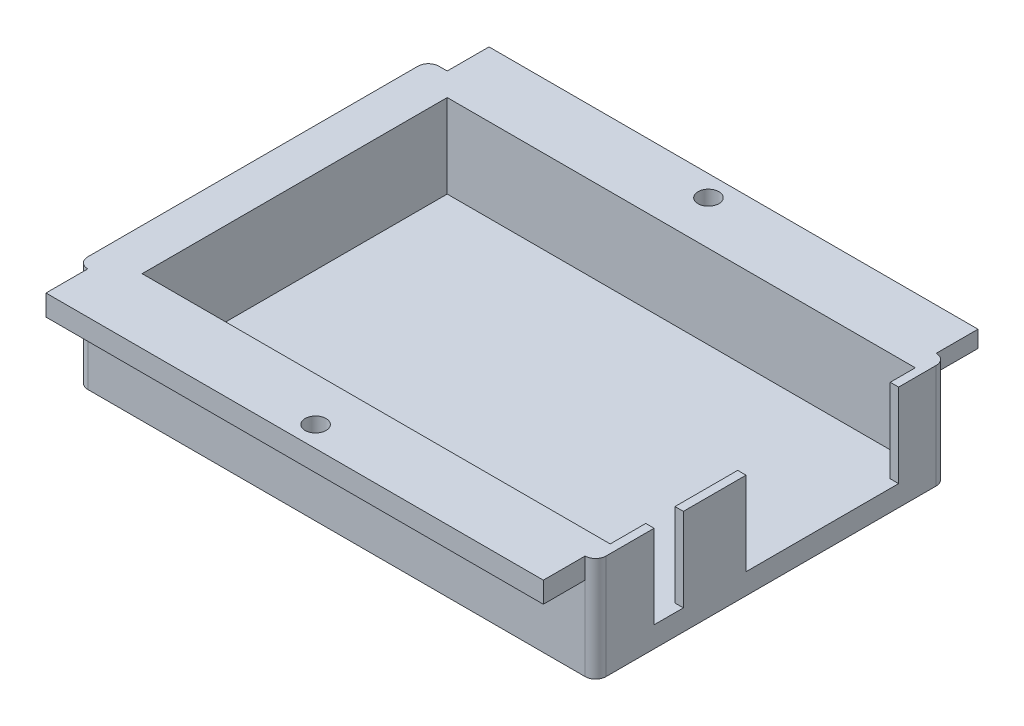
ISO-10303-21;
HEADER;
FILE_DESCRIPTION(('STEP AP214'),'2;1');
FILE_NAME('part.step','',(''),(''),'','','');
FILE_SCHEMA(('AUTOMOTIVE_DESIGN { 1 0 10303 214 1 1 1 1 }'));
ENDSEC;
DATA;
#1=APPLICATION_CONTEXT('core data for automotive mechanical design processes');
#2=APPLICATION_PROTOCOL_DEFINITION('international standard','automotive_design',2000,#1);
#3=PRODUCT_CONTEXT('',#1,'mechanical');
#4=PRODUCT('Part','Part','',(#3));
#5=PRODUCT_RELATED_PRODUCT_CATEGORY('part','',(#4));
#6=PRODUCT_DEFINITION_FORMATION('','',#4);
#7=PRODUCT_DEFINITION_CONTEXT('part definition',#1,'design');
#8=PRODUCT_DEFINITION('design','',#6,#7);
#9=PRODUCT_DEFINITION_SHAPE('','',#8);
#10=(LENGTH_UNIT() NAMED_UNIT(*) SI_UNIT(.MILLI.,.METRE.));
#11=(NAMED_UNIT(*) PLANE_ANGLE_UNIT() SI_UNIT($,.RADIAN.));
#12=(NAMED_UNIT(*) SI_UNIT($,.STERADIAN.) SOLID_ANGLE_UNIT());
#13=UNCERTAINTY_MEASURE_WITH_UNIT(LENGTH_MEASURE(1.E-05),#10,'distance_accuracy_value','');
#14=(GEOMETRIC_REPRESENTATION_CONTEXT(3) GLOBAL_UNCERTAINTY_ASSIGNED_CONTEXT((#13)) GLOBAL_UNIT_ASSIGNED_CONTEXT((#10,
#11,#12)) REPRESENTATION_CONTEXT('',''));
#15=CARTESIAN_POINT('',(0.,0.,0.));
#16=DIRECTION('',(0.,0.,1.));
#17=DIRECTION('',(1.,0.,0.));
#18=AXIS2_PLACEMENT_3D('',#15,#16,#17);
#19=CARTESIAN_POINT('',(-62.,25.,-42.));
#20=DIRECTION('',(0.,0.,1.));
#21=DIRECTION('',(1.,0.,0.));
#22=AXIS2_PLACEMENT_3D('',#19,#20,#21);
#23=PLANE('',#22);
#24=DIRECTION('',(-1.,0.,0.));
#25=VECTOR('',#24,1.);
#26=CARTESIAN_POINT('',(59.5,21.,-42.));
#27=LINE('',#26,#25);
#28=CARTESIAN_POINT('',(59.5,21.,-42.));
#29=VERTEX_POINT('',#28);
#30=CARTESIAN_POINT('',(-57.5,21.,-42.));
#31=VERTEX_POINT('',#30);
#32=EDGE_CURVE('E410',#29,#31,#27,.T.);
#33=ORIENTED_EDGE('',*,*,#32,.F.);
#34=DIRECTION('',(0.,-1.,0.));
#35=VECTOR('',#34,1.);
#36=CARTESIAN_POINT('',(59.5,25.,-42.));
#37=LINE('',#36,#35);
#38=CARTESIAN_POINT('',(59.5,0.,-42.));
#39=VERTEX_POINT('',#38);
#40=EDGE_CURVE('E385',#29,#39,#37,.T.);
#41=ORIENTED_EDGE('',*,*,#40,.T.);
#42=DIRECTION('',(-1.,0.,0.));
#43=VECTOR('',#42,1.);
#44=CARTESIAN_POINT('',(-62.,0.,-42.));
#45=LINE('',#44,#43);
#46=CARTESIAN_POINT('',(-59.5,0.,-42.));
#47=VERTEX_POINT('',#46);
#48=EDGE_CURVE('E364',#39,#47,#45,.T.);
#49=ORIENTED_EDGE('',*,*,#48,.T.);
#50=DIRECTION('',(0.,-1.,0.));
#51=VECTOR('',#50,1.);
#52=CARTESIAN_POINT('',(-59.5,25.,-42.));
#53=LINE('',#52,#51);
#54=CARTESIAN_POINT('',(-59.5,25.,-42.));
#55=VERTEX_POINT('',#54);
#56=EDGE_CURVE('E387',#47,#55,#53,.F.);
#57=ORIENTED_EDGE('',*,*,#56,.T.);
#58=DIRECTION('',(-1.,0.,0.));
#59=VECTOR('',#58,1.);
#60=CARTESIAN_POINT('',(-62.,25.,-42.));
#61=LINE('',#60,#59);
#62=CARTESIAN_POINT('',(-57.5,25.,-42.));
#63=VERTEX_POINT('',#62);
#64=EDGE_CURVE('E61',#63,#55,#61,.T.);
#65=ORIENTED_EDGE('',*,*,#64,.F.);
#66=DIRECTION('',(0.,1.,0.));
#67=VECTOR('',#66,1.);
#68=CARTESIAN_POINT('',(-57.5,25.,-42.));
#69=LINE('',#68,#67);
#70=EDGE_CURVE('E56',#31,#63,#69,.T.);
#71=ORIENTED_EDGE('',*,*,#70,.F.);
#72=EDGE_LOOP('',(#33,#41,#49,#57,#65,#71));
#73=FACE_BOUND('',#72,.T.);
#74=ADVANCED_FACE('F39',(#73),#23,.F.);
#75=CARTESIAN_POINT('',(-62.,25.,42.));
#76=DIRECTION('',(0.,0.,-1.));
#77=DIRECTION('',(-1.,0.,0.));
#78=AXIS2_PLACEMENT_3D('',#75,#76,#77);
#79=PLANE('',#78);
#80=DIRECTION('',(1.,0.,0.));
#81=VECTOR('',#80,1.);
#82=CARTESIAN_POINT('',(-59.5,20.,42.));
#83=LINE('',#82,#81);
#84=CARTESIAN_POINT('',(-59.5,20.,42.));
#85=VERTEX_POINT('',#84);
#86=CARTESIAN_POINT('',(59.5,20.,42.));
#87=VERTEX_POINT('',#86);
#88=EDGE_CURVE('E240',#85,#87,#83,.T.);
#89=ORIENTED_EDGE('',*,*,#88,.F.);
#90=DIRECTION('',(0.,-1.,0.));
#91=VECTOR('',#90,1.);
#92=CARTESIAN_POINT('',(-59.5,25.,42.));
#93=LINE('',#92,#91);
#94=CARTESIAN_POINT('',(-59.5,0.,42.));
#95=VERTEX_POINT('',#94);
#96=EDGE_CURVE('E402',#85,#95,#93,.T.);
#97=ORIENTED_EDGE('',*,*,#96,.T.);
#98=DIRECTION('',(1.,0.,0.));
#99=VECTOR('',#98,1.);
#100=CARTESIAN_POINT('',(-62.,0.,42.));
#101=LINE('',#100,#99);
#102=CARTESIAN_POINT('',(59.5,0.,42.));
#103=VERTEX_POINT('',#102);
#104=EDGE_CURVE('E370',#95,#103,#101,.T.);
#105=ORIENTED_EDGE('',*,*,#104,.T.);
#106=DIRECTION('',(0.,-1.,0.));
#107=VECTOR('',#106,1.);
#108=CARTESIAN_POINT('',(59.5,25.,42.));
#109=LINE('',#108,#107);
#110=EDGE_CURVE('E11',#103,#87,#109,.F.);
#111=ORIENTED_EDGE('',*,*,#110,.T.);
#112=EDGE_LOOP('',(#89,#97,#105,#111));
#113=FACE_BOUND('',#112,.T.);
#114=ADVANCED_FACE('F441',(#113),#79,.F.);
#115=CARTESIAN_POINT('',(0.,25.,0.));
#116=DIRECTION('',(0.,-1.,0.));
#117=DIRECTION('',(0.,0.,-1.));
#118=AXIS2_PLACEMENT_3D('',#115,#116,#117);
#119=PLANE('',#118);
#120=DIRECTION('',(0.,0.,-1.));
#121=VECTOR('',#120,1.);
#122=CARTESIAN_POINT('',(60.,25.,36.5));
#123=LINE('',#122,#121);
#124=CARTESIAN_POINT('',(60.,25.,21.));
#125=VERTEX_POINT('',#124);
#126=CARTESIAN_POINT('',(60.,25.,5.99999999999999));
#127=VERTEX_POINT('',#126);
#128=EDGE_CURVE('E335',#125,#127,#123,.T.);
#129=ORIENTED_EDGE('',*,*,#128,.F.);
#130=DIRECTION('',(-1.,0.,0.));
#131=VECTOR('',#130,1.);
#132=CARTESIAN_POINT('',(62.,25.,21.));
#133=LINE('',#132,#131);
#134=CARTESIAN_POINT('',(62.,25.,21.));
#135=VERTEX_POINT('',#134);
#136=EDGE_CURVE('E277',#135,#125,#133,.T.);
#137=ORIENTED_EDGE('',*,*,#136,.F.);
#138=DIRECTION('',(0.,0.,-1.));
#139=VECTOR('',#138,1.);
#140=CARTESIAN_POINT('',(62.,25.,42.));
#141=LINE('',#140,#139);
#142=CARTESIAN_POINT('',(62.,25.,5.99999999999999));
#143=VERTEX_POINT('',#142);
#144=EDGE_CURVE('E355',#135,#143,#141,.T.);
#145=ORIENTED_EDGE('',*,*,#144,.T.);
#146=DIRECTION('',(1.,0.,0.));
#147=VECTOR('',#146,1.);
#148=CARTESIAN_POINT('',(62.,25.,5.99999999999999));
#149=LINE('',#148,#147);
#150=EDGE_CURVE('E285',#127,#143,#149,.T.);
#151=ORIENTED_EDGE('',*,*,#150,.F.);
#152=EDGE_LOOP('',(#129,#137,#145,#151));
#153=FACE_BOUND('',#152,.T.);
#154=ADVANCED_FACE('F448',(#153),#119,.F.);
#155=CARTESIAN_POINT('',(60.,5.,36.5));
#156=DIRECTION('',(1.,0.,0.));
#157=DIRECTION('',(0.,0.,-1.));
#158=AXIS2_PLACEMENT_3D('',#155,#156,#157);
#159=PLANE('',#158);
#160=DIRECTION('',(0.,0.,-1.));
#161=VECTOR('',#160,1.);
#162=CARTESIAN_POINT('',(60.,5.,36.5));
#163=LINE('',#162,#161);
#164=CARTESIAN_POINT('',(60.,5.,21.));
#165=VERTEX_POINT('',#164);
#166=CARTESIAN_POINT('',(60.,5.,5.99999999999999));
#167=VERTEX_POINT('',#166);
#168=EDGE_CURVE('E320',#165,#167,#163,.T.);
#169=ORIENTED_EDGE('',*,*,#168,.F.);
#170=DIRECTION('',(0.,1.,0.));
#171=VECTOR('',#170,1.);
#172=CARTESIAN_POINT('',(60.,5.,21.));
#173=LINE('',#172,#171);
#174=EDGE_CURVE('E287',#165,#125,#173,.T.);
#175=ORIENTED_EDGE('',*,*,#174,.T.);
#176=ORIENTED_EDGE('',*,*,#128,.T.);
#177=DIRECTION('',(0.,1.,0.));
#178=VECTOR('',#177,1.);
#179=CARTESIAN_POINT('',(60.,5.,5.99999999999999));
#180=LINE('',#179,#178);
#181=EDGE_CURVE('E297',#167,#127,#180,.T.);
#182=ORIENTED_EDGE('',*,*,#181,.F.);
#183=EDGE_LOOP('',(#169,#175,#176,#182));
#184=FACE_BOUND('',#183,.T.);
#185=ADVANCED_FACE('F550',(#184),#159,.F.);
#186=CARTESIAN_POINT('',(60.,5.,-30.5));
#187=VERTEX_POINT('',#186);
#188=CARTESIAN_POINT('',(60.,5.,-36.5));
#189=VERTEX_POINT('',#188);
#190=EDGE_CURVE('E321',#187,#189,#163,.T.);
#191=ORIENTED_EDGE('',*,*,#190,.F.);
#192=DIRECTION('',(0.,1.,0.));
#193=VECTOR('',#192,1.);
#194=CARTESIAN_POINT('',(60.,5.,-30.5));
#195=LINE('',#194,#193);
#196=CARTESIAN_POINT('',(60.,25.,-30.5));
#197=VERTEX_POINT('',#196);
#198=EDGE_CURVE('E272',#187,#197,#195,.T.);
#199=ORIENTED_EDGE('',*,*,#198,.T.);
#200=CARTESIAN_POINT('',(60.,25.,-36.5));
#201=VERTEX_POINT('',#200);
#202=EDGE_CURVE('E290',#197,#201,#123,.T.);
#203=ORIENTED_EDGE('',*,*,#202,.T.);
#204=DIRECTION('',(0.,1.,0.));
#205=VECTOR('',#204,1.);
#206=CARTESIAN_POINT('',(60.,5.,-36.5));
#207=LINE('',#206,#205);
#208=EDGE_CURVE('E330',#189,#201,#207,.T.);
#209=ORIENTED_EDGE('',*,*,#208,.F.);
#210=EDGE_LOOP('',(#191,#199,#203,#209));
#211=FACE_BOUND('',#210,.T.);
#212=ADVANCED_FACE('F457',(#211),#159,.F.);
#213=CARTESIAN_POINT('',(62.,25.,42.));
#214=DIRECTION('',(-1.,0.,0.));
#215=DIRECTION('',(0.,0.,1.));
#216=AXIS2_PLACEMENT_3D('',#213,#214,#215);
#217=PLANE('',#216);
#218=DIRECTION('',(0.,0.,-1.));
#219=VECTOR('',#218,1.);
#220=CARTESIAN_POINT('',(62.,0.,42.));
#221=LINE('',#220,#219);
#222=CARTESIAN_POINT('',(62.,0.,39.5));
#223=VERTEX_POINT('',#222);
#224=CARTESIAN_POINT('',(62.,0.,-39.5));
#225=VERTEX_POINT('',#224);
#226=EDGE_CURVE('E346',#223,#225,#221,.T.);
#227=ORIENTED_EDGE('',*,*,#226,.T.);
#228=DIRECTION('',(0.,-1.,0.));
#229=VECTOR('',#228,1.);
#230=CARTESIAN_POINT('',(62.,25.,-39.5));
#231=LINE('',#230,#229);
#232=CARTESIAN_POINT('',(62.,25.,-39.5));
#233=VERTEX_POINT('',#232);
#234=EDGE_CURVE('E400',#225,#233,#231,.F.);
#235=ORIENTED_EDGE('',*,*,#234,.T.);
#236=CARTESIAN_POINT('',(62.,25.,-30.5));
#237=VERTEX_POINT('',#236);
#238=EDGE_CURVE('E356',#237,#233,#141,.T.);
#239=ORIENTED_EDGE('',*,*,#238,.F.);
#240=DIRECTION('',(0.,1.,0.));
#241=VECTOR('',#240,1.);
#242=CARTESIAN_POINT('',(62.,5.,-30.5));
#243=LINE('',#242,#241);
#244=CARTESIAN_POINT('',(62.,5.,-30.5));
#245=VERTEX_POINT('',#244);
#246=EDGE_CURVE('E303',#245,#237,#243,.T.);
#247=ORIENTED_EDGE('',*,*,#246,.F.);
#248=DIRECTION('',(0.,0.,-1.));
#249=VECTOR('',#248,1.);
#250=CARTESIAN_POINT('',(62.,5.,-30.5));
#251=LINE('',#250,#249);
#252=CARTESIAN_POINT('',(62.,5.,5.99999999999999));
#253=VERTEX_POINT('',#252);
#254=EDGE_CURVE('E312',#253,#245,#251,.T.);
#255=ORIENTED_EDGE('',*,*,#254,.F.);
#256=DIRECTION('',(0.,1.,0.));
#257=VECTOR('',#256,1.);
#258=CARTESIAN_POINT('',(62.,5.,5.99999999999999));
#259=LINE('',#258,#257);
#260=EDGE_CURVE('E300',#253,#143,#259,.T.);
#261=ORIENTED_EDGE('',*,*,#260,.T.);
#262=ORIENTED_EDGE('',*,*,#144,.F.);
#263=DIRECTION('',(0.,1.,0.));
#264=VECTOR('',#263,1.);
#265=CARTESIAN_POINT('',(62.,5.,21.));
#266=LINE('',#265,#264);
#267=CARTESIAN_POINT('',(62.,5.,21.));
#268=VERTEX_POINT('',#267);
#269=EDGE_CURVE('E291',#268,#135,#266,.T.);
#270=ORIENTED_EDGE('',*,*,#269,.F.);
#271=DIRECTION('',(0.,0.,-1.));
#272=VECTOR('',#271,1.);
#273=CARTESIAN_POINT('',(62.,5.,28.));
#274=LINE('',#273,#272);
#275=CARTESIAN_POINT('',(62.,5.,28.));
#276=VERTEX_POINT('',#275);
#277=EDGE_CURVE('E276',#276,#268,#274,.T.);
#278=ORIENTED_EDGE('',*,*,#277,.F.);
#279=DIRECTION('',(0.,1.,0.));
#280=VECTOR('',#279,1.);
#281=CARTESIAN_POINT('',(62.,5.,28.));
#282=LINE('',#281,#280);
#283=CARTESIAN_POINT('',(62.,25.,28.));
#284=VERTEX_POINT('',#283);
#285=EDGE_CURVE('E293',#276,#284,#282,.T.);
#286=ORIENTED_EDGE('',*,*,#285,.T.);
#287=CARTESIAN_POINT('',(62.,25.,39.5));
#288=VERTEX_POINT('',#287);
#289=EDGE_CURVE('E353',#288,#284,#141,.T.);
#290=ORIENTED_EDGE('',*,*,#289,.F.);
#291=DIRECTION('',(0.,-1.,0.));
#292=VECTOR('',#291,1.);
#293=CARTESIAN_POINT('',(62.,25.,39.5));
#294=LINE('',#293,#292);
#295=EDGE_CURVE('E397',#288,#223,#294,.T.);
#296=ORIENTED_EDGE('',*,*,#295,.T.);
#297=EDGE_LOOP('',(#227,#235,#239,#247,#255,#261,#262,#270,#278,#286,#290,#296));
#298=FACE_BOUND('',#297,.T.);
#299=ADVANCED_FACE('F454',(#298),#217,.F.);
#300=CARTESIAN_POINT('',(-62.,25.,42.));
#301=DIRECTION('',(1.,0.,0.));
#302=DIRECTION('',(0.,0.,-1.));
#303=AXIS2_PLACEMENT_3D('',#300,#301,#302);
#304=PLANE('',#303);
#305=DIRECTION('',(0.,0.,1.));
#306=VECTOR('',#305,1.);
#307=CARTESIAN_POINT('',(-62.,25.,42.));
#308=LINE('',#307,#306);
#309=CARTESIAN_POINT('',(-62.,25.,-39.5));
#310=VERTEX_POINT('',#309);
#311=CARTESIAN_POINT('',(-62.,25.,39.5));
#312=VERTEX_POINT('',#311);
#313=EDGE_CURVE('E358',#310,#312,#308,.T.);
#314=ORIENTED_EDGE('',*,*,#313,.F.);
#315=DIRECTION('',(0.,-1.,0.));
#316=VECTOR('',#315,1.);
#317=CARTESIAN_POINT('',(-62.,25.,-39.5));
#318=LINE('',#317,#316);
#319=CARTESIAN_POINT('',(-62.,0.,-39.5));
#320=VERTEX_POINT('',#319);
#321=EDGE_CURVE('E374',#310,#320,#318,.T.);
#322=ORIENTED_EDGE('',*,*,#321,.T.);
#323=DIRECTION('',(0.,0.,1.));
#324=VECTOR('',#323,1.);
#325=CARTESIAN_POINT('',(-62.,0.,42.));
#326=LINE('',#325,#324);
#327=CARTESIAN_POINT('',(-62.,0.,39.5));
#328=VERTEX_POINT('',#327);
#329=EDGE_CURVE('E367',#320,#328,#326,.T.);
#330=ORIENTED_EDGE('',*,*,#329,.T.);
#331=DIRECTION('',(0.,-1.,0.));
#332=VECTOR('',#331,1.);
#333=CARTESIAN_POINT('',(-62.,25.,39.5));
#334=LINE('',#333,#332);
#335=EDGE_CURVE('E361',#328,#312,#334,.F.);
#336=ORIENTED_EDGE('',*,*,#335,.T.);
#337=EDGE_LOOP('',(#314,#322,#330,#336));
#338=FACE_BOUND('',#337,.T.);
#339=ADVANCED_FACE('F453',(#338),#304,.F.);
#340=CARTESIAN_POINT('',(0.,25.,-47.));
#341=DIRECTION('',(0.,1.,0.));
#342=DIRECTION('',(0.,0.,1.));
#343=AXIS2_PLACEMENT_3D('',#340,#341,#342);
#344=CIRCLE('',#343,2.5);
#345=CARTESIAN_POINT('',(0.,25.,-44.5));
#346=VERTEX_POINT('',#345);
#347=EDGE_CURVE('E406',#346,#346,#344,.T.);
#348=ORIENTED_EDGE('',*,*,#347,.F.);
#349=EDGE_LOOP('',(#348));
#350=FACE_BOUND('',#349,.T.);
#351=CARTESIAN_POINT('',(0.,25.,47.));
#352=DIRECTION('',(0.,1.,0.));
#353=DIRECTION('',(0.,0.,1.));
#354=AXIS2_PLACEMENT_3D('',#351,#352,#353);
#355=CIRCLE('',#354,2.5);
#356=CARTESIAN_POINT('',(0.,25.,49.5));
#357=VERTEX_POINT('',#356);
#358=EDGE_CURVE('E412',#357,#357,#355,.T.);
#359=ORIENTED_EDGE('',*,*,#358,.F.);
#360=EDGE_LOOP('',(#359));
#361=FACE_BOUND('',#360,.T.);
#362=CARTESIAN_POINT('',(59.5,25.,-39.5));
#363=DIRECTION('',(0.,-1.,0.));
#364=DIRECTION('',(0.,0.,-1.));
#365=AXIS2_PLACEMENT_3D('',#362,#363,#364);
#366=CIRCLE('',#365,2.5);
#367=CARTESIAN_POINT('',(59.5,25.,-42.));
#368=VERTEX_POINT('',#367);
#369=EDGE_CURVE('E393',#233,#368,#366,.F.);
#370=ORIENTED_EDGE('',*,*,#369,.T.);
#371=DIRECTION('',(0.,0.,1.));
#372=VECTOR('',#371,1.);
#373=CARTESIAN_POINT('',(59.5,25.,-52.));
#374=LINE('',#373,#372);
#375=CARTESIAN_POINT('',(59.5,25.,-52.));
#376=VERTEX_POINT('',#375);
#377=EDGE_CURVE('E421',#376,#368,#374,.T.);
#378=ORIENTED_EDGE('',*,*,#377,.F.);
#379=DIRECTION('',(1.,0.,0.));
#380=VECTOR('',#379,1.);
#381=CARTESIAN_POINT('',(59.5,25.,-52.));
#382=LINE('',#381,#380);
#383=CARTESIAN_POINT('',(-57.5,25.,-52.));
#384=VERTEX_POINT('',#383);
#385=EDGE_CURVE('E232',#384,#376,#382,.T.);
#386=ORIENTED_EDGE('',*,*,#385,.F.);
#387=DIRECTION('',(0.,0.,1.));
#388=VECTOR('',#387,1.);
#389=CARTESIAN_POINT('',(-57.5,25.,-52.));
#390=LINE('',#389,#388);
#391=EDGE_CURVE('E245',#384,#63,#390,.T.);
#392=ORIENTED_EDGE('',*,*,#391,.T.);
#393=ORIENTED_EDGE('',*,*,#64,.T.);
#394=CARTESIAN_POINT('',(-59.5,25.,-39.5));
#395=DIRECTION('',(0.,-1.,0.));
#396=DIRECTION('',(0.,0.,-1.));
#397=AXIS2_PLACEMENT_3D('',#394,#395,#396);
#398=CIRCLE('',#397,2.5);
#399=EDGE_CURVE('E395',#55,#310,#398,.F.);
#400=ORIENTED_EDGE('',*,*,#399,.T.);
#401=ORIENTED_EDGE('',*,*,#313,.T.);
#402=CARTESIAN_POINT('',(-59.5,25.,39.5));
#403=DIRECTION('',(0.,-1.,0.));
#404=DIRECTION('',(0.,0.,-1.));
#405=AXIS2_PLACEMENT_3D('',#402,#403,#404);
#406=CIRCLE('',#405,2.5);
#407=CARTESIAN_POINT('',(-59.5,25.,42.));
#408=VERTEX_POINT('',#407);
#409=EDGE_CURVE('E389',#312,#408,#406,.F.);
#410=ORIENTED_EDGE('',*,*,#409,.T.);
#411=DIRECTION('',(0.,0.,-1.));
#412=VECTOR('',#411,1.);
#413=CARTESIAN_POINT('',(-59.5,25.,52.));
#414=LINE('',#413,#412);
#415=CARTESIAN_POINT('',(-59.5,25.,52.));
#416=VERTEX_POINT('',#415);
#417=EDGE_CURVE('E257',#416,#408,#414,.T.);
#418=ORIENTED_EDGE('',*,*,#417,.F.);
#419=DIRECTION('',(-1.,0.,0.));
#420=VECTOR('',#419,1.);
#421=CARTESIAN_POINT('',(-59.5,25.,52.));
#422=LINE('',#421,#420);
#423=CARTESIAN_POINT('',(59.5,25.,52.));
#424=VERTEX_POINT('',#423);
#425=EDGE_CURVE('E256',#424,#416,#422,.T.);
#426=ORIENTED_EDGE('',*,*,#425,.F.);
#427=DIRECTION('',(0.,0.,-1.));
#428=VECTOR('',#427,1.);
#429=CARTESIAN_POINT('',(59.5,25.,52.));
#430=LINE('',#429,#428);
#431=CARTESIAN_POINT('',(59.5,25.,42.));
#432=VERTEX_POINT('',#431);
#433=EDGE_CURVE('E263',#424,#432,#430,.T.);
#434=ORIENTED_EDGE('',*,*,#433,.T.);
#435=CARTESIAN_POINT('',(59.5,25.,39.5));
#436=DIRECTION('',(0.,-1.,0.));
#437=DIRECTION('',(0.,0.,-1.));
#438=AXIS2_PLACEMENT_3D('',#435,#436,#437);
#439=CIRCLE('',#438,2.5);
#440=EDGE_CURVE('E391',#432,#288,#439,.F.);
#441=ORIENTED_EDGE('',*,*,#440,.T.);
#442=ORIENTED_EDGE('',*,*,#289,.T.);
#443=DIRECTION('',(1.,0.,0.));
#444=VECTOR('',#443,1.);
#445=CARTESIAN_POINT('',(60.,25.,28.));
#446=LINE('',#445,#444);
#447=CARTESIAN_POINT('',(60.,25.,28.));
#448=VERTEX_POINT('',#447);
#449=EDGE_CURVE('E282',#448,#284,#446,.T.);
#450=ORIENTED_EDGE('',*,*,#449,.F.);
#451=CARTESIAN_POINT('',(60.,25.,36.5));
#452=VERTEX_POINT('',#451);
#453=EDGE_CURVE('E331',#452,#448,#123,.T.);
#454=ORIENTED_EDGE('',*,*,#453,.F.);
#455=DIRECTION('',(1.,0.,0.));
#456=VECTOR('',#455,1.);
#457=CARTESIAN_POINT('',(-52.,25.,36.5));
#458=LINE('',#457,#456);
#459=CARTESIAN_POINT('',(-52.,25.,36.5));
#460=VERTEX_POINT('',#459);
#461=EDGE_CURVE('E341',#460,#452,#458,.T.);
#462=ORIENTED_EDGE('',*,*,#461,.F.);
#463=DIRECTION('',(0.,0.,1.));
#464=VECTOR('',#463,1.);
#465=CARTESIAN_POINT('',(-52.,25.,-36.5));
#466=LINE('',#465,#464);
#467=CARTESIAN_POINT('',(-52.,25.,-36.5));
#468=VERTEX_POINT('',#467);
#469=EDGE_CURVE('E338',#468,#460,#466,.T.);
#470=ORIENTED_EDGE('',*,*,#469,.F.);
#471=DIRECTION('',(-1.,0.,0.));
#472=VECTOR('',#471,1.);
#473=CARTESIAN_POINT('',(-52.,25.,-36.5));
#474=LINE('',#473,#472);
#475=EDGE_CURVE('E334',#201,#468,#474,.T.);
#476=ORIENTED_EDGE('',*,*,#475,.F.);
#477=ORIENTED_EDGE('',*,*,#202,.F.);
#478=DIRECTION('',(-1.,0.,0.));
#479=VECTOR('',#478,1.);
#480=CARTESIAN_POINT('',(60.,25.,-30.5));
#481=LINE('',#480,#479);
#482=EDGE_CURVE('E307',#237,#197,#481,.T.);
#483=ORIENTED_EDGE('',*,*,#482,.F.);
#484=ORIENTED_EDGE('',*,*,#238,.T.);
#485=EDGE_LOOP('',(#370,#378,#386,#392,#393,#400,#401,#410,#418,#426,#434,#441,#442,#450,#454,
#462,#470,#476,#477,#483,#484));
#486=FACE_BOUND('',#485,.T.);
#487=ADVANCED_FACE('F427',(#350,#361,#486),#119,.F.);
#488=CARTESIAN_POINT('',(0.,0.,0.));
#489=DIRECTION('',(0.,-1.,0.));
#490=DIRECTION('',(0.,0.,-1.));
#491=AXIS2_PLACEMENT_3D('',#488,#489,#490);
#492=PLANE('',#491);
#493=ORIENTED_EDGE('',*,*,#329,.F.);
#494=CARTESIAN_POINT('',(-59.5,0.,-39.5));
#495=DIRECTION('',(0.,-1.,0.));
#496=DIRECTION('',(0.,0.,-1.));
#497=AXIS2_PLACEMENT_3D('',#494,#495,#496);
#498=CIRCLE('',#497,2.5);
#499=EDGE_CURVE('E383',#320,#47,#498,.T.);
#500=ORIENTED_EDGE('',*,*,#499,.T.);
#501=ORIENTED_EDGE('',*,*,#48,.F.);
#502=CARTESIAN_POINT('',(59.5,0.,-39.5));
#503=DIRECTION('',(0.,-1.,0.));
#504=DIRECTION('',(0.,0.,-1.));
#505=AXIS2_PLACEMENT_3D('',#502,#503,#504);
#506=CIRCLE('',#505,2.5);
#507=EDGE_CURVE('E381',#39,#225,#506,.T.);
#508=ORIENTED_EDGE('',*,*,#507,.T.);
#509=ORIENTED_EDGE('',*,*,#226,.F.);
#510=CARTESIAN_POINT('',(59.5,0.,39.5));
#511=DIRECTION('',(0.,-1.,0.));
#512=DIRECTION('',(0.,0.,-1.));
#513=AXIS2_PLACEMENT_3D('',#510,#511,#512);
#514=CIRCLE('',#513,2.5);
#515=EDGE_CURVE('E379',#223,#103,#514,.T.);
#516=ORIENTED_EDGE('',*,*,#515,.T.);
#517=ORIENTED_EDGE('',*,*,#104,.F.);
#518=CARTESIAN_POINT('',(-59.5,0.,39.5));
#519=DIRECTION('',(0.,-1.,0.));
#520=DIRECTION('',(0.,0.,-1.));
#521=AXIS2_PLACEMENT_3D('',#518,#519,#520);
#522=CIRCLE('',#521,2.5);
#523=EDGE_CURVE('E377',#95,#328,#522,.T.);
#524=ORIENTED_EDGE('',*,*,#523,.T.);
#525=EDGE_LOOP('',(#493,#500,#501,#508,#509,#516,#517,#524));
#526=FACE_BOUND('',#525,.T.);
#527=ADVANCED_FACE('F497',(#526),#492,.T.);
#528=ORIENTED_EDGE('',*,*,#453,.T.);
#529=DIRECTION('',(0.,1.,0.));
#530=VECTOR('',#529,1.);
#531=CARTESIAN_POINT('',(60.,5.,28.));
#532=LINE('',#531,#530);
#533=CARTESIAN_POINT('',(60.,5.,28.));
#534=VERTEX_POINT('',#533);
#535=EDGE_CURVE('E281',#534,#448,#532,.T.);
#536=ORIENTED_EDGE('',*,*,#535,.F.);
#537=CARTESIAN_POINT('',(60.,5.,36.5));
#538=VERTEX_POINT('',#537);
#539=EDGE_CURVE('E316',#538,#534,#163,.T.);
#540=ORIENTED_EDGE('',*,*,#539,.F.);
#541=DIRECTION('',(0.,1.,0.));
#542=VECTOR('',#541,1.);
#543=CARTESIAN_POINT('',(60.,5.,36.5));
#544=LINE('',#543,#542);
#545=EDGE_CURVE('E344',#538,#452,#544,.T.);
#546=ORIENTED_EDGE('',*,*,#545,.T.);
#547=EDGE_LOOP('',(#528,#536,#540,#546));
#548=FACE_BOUND('',#547,.T.);
#549=ADVANCED_FACE('F547',(#548),#159,.F.);
#550=CARTESIAN_POINT('',(-52.,5.,36.5));
#551=DIRECTION('',(0.,0.,1.));
#552=DIRECTION('',(1.,0.,0.));
#553=AXIS2_PLACEMENT_3D('',#550,#551,#552);
#554=PLANE('',#553);
#555=ORIENTED_EDGE('',*,*,#461,.T.);
#556=ORIENTED_EDGE('',*,*,#545,.F.);
#557=DIRECTION('',(1.,0.,0.));
#558=VECTOR('',#557,1.);
#559=CARTESIAN_POINT('',(-52.,5.,36.5));
#560=LINE('',#559,#558);
#561=CARTESIAN_POINT('',(-52.,5.,36.5));
#562=VERTEX_POINT('',#561);
#563=EDGE_CURVE('E327',#562,#538,#560,.T.);
#564=ORIENTED_EDGE('',*,*,#563,.F.);
#565=DIRECTION('',(0.,1.,0.));
#566=VECTOR('',#565,1.);
#567=CARTESIAN_POINT('',(-52.,5.,36.5));
#568=LINE('',#567,#566);
#569=EDGE_CURVE('E347',#562,#460,#568,.T.);
#570=ORIENTED_EDGE('',*,*,#569,.T.);
#571=EDGE_LOOP('',(#555,#556,#564,#570));
#572=FACE_BOUND('',#571,.T.);
#573=ADVANCED_FACE('F541',(#572),#554,.F.);
#574=CARTESIAN_POINT('',(-52.,5.,-36.5));
#575=DIRECTION('',(-1.,0.,0.));
#576=DIRECTION('',(0.,0.,1.));
#577=AXIS2_PLACEMENT_3D('',#574,#575,#576);
#578=PLANE('',#577);
#579=ORIENTED_EDGE('',*,*,#469,.T.);
#580=ORIENTED_EDGE('',*,*,#569,.F.);
#581=DIRECTION('',(0.,0.,1.));
#582=VECTOR('',#581,1.);
#583=CARTESIAN_POINT('',(-52.,5.,-36.5));
#584=LINE('',#583,#582);
#585=CARTESIAN_POINT('',(-52.,5.,-36.5));
#586=VERTEX_POINT('',#585);
#587=EDGE_CURVE('E324',#586,#562,#584,.T.);
#588=ORIENTED_EDGE('',*,*,#587,.F.);
#589=DIRECTION('',(0.,1.,0.));
#590=VECTOR('',#589,1.);
#591=CARTESIAN_POINT('',(-52.,5.,-36.5));
#592=LINE('',#591,#590);
#593=EDGE_CURVE('E349',#586,#468,#592,.T.);
#594=ORIENTED_EDGE('',*,*,#593,.T.);
#595=EDGE_LOOP('',(#579,#580,#588,#594));
#596=FACE_BOUND('',#595,.T.);
#597=ADVANCED_FACE('F538',(#596),#578,.F.);
#598=CARTESIAN_POINT('',(-52.,5.,-36.5));
#599=DIRECTION('',(0.,0.,-1.));
#600=DIRECTION('',(-1.,0.,0.));
#601=AXIS2_PLACEMENT_3D('',#598,#599,#600);
#602=PLANE('',#601);
#603=ORIENTED_EDGE('',*,*,#475,.T.);
#604=ORIENTED_EDGE('',*,*,#593,.F.);
#605=DIRECTION('',(-1.,0.,0.));
#606=VECTOR('',#605,1.);
#607=CARTESIAN_POINT('',(-52.,5.,-36.5));
#608=LINE('',#607,#606);
#609=EDGE_CURVE('E319',#189,#586,#608,.T.);
#610=ORIENTED_EDGE('',*,*,#609,.F.);
#611=ORIENTED_EDGE('',*,*,#208,.T.);
#612=EDGE_LOOP('',(#603,#604,#610,#611));
#613=FACE_BOUND('',#612,.T.);
#614=ADVANCED_FACE('F534',(#613),#602,.F.);
#615=CARTESIAN_POINT('',(0.,5.,0.));
#616=DIRECTION('',(0.,-1.,0.));
#617=DIRECTION('',(0.,0.,-1.));
#618=AXIS2_PLACEMENT_3D('',#615,#616,#617);
#619=PLANE('',#618);
#620=ORIENTED_EDGE('',*,*,#539,.T.);
#621=DIRECTION('',(1.,0.,0.));
#622=VECTOR('',#621,1.);
#623=CARTESIAN_POINT('',(60.,5.,28.));
#624=LINE('',#623,#622);
#625=EDGE_CURVE('E273',#534,#276,#624,.T.);
#626=ORIENTED_EDGE('',*,*,#625,.T.);
#627=ORIENTED_EDGE('',*,*,#277,.T.);
#628=DIRECTION('',(-1.,0.,0.));
#629=VECTOR('',#628,1.);
#630=CARTESIAN_POINT('',(62.,5.,21.));
#631=LINE('',#630,#629);
#632=EDGE_CURVE('E279',#268,#165,#631,.T.);
#633=ORIENTED_EDGE('',*,*,#632,.T.);
#634=ORIENTED_EDGE('',*,*,#168,.T.);
#635=DIRECTION('',(1.,0.,0.));
#636=VECTOR('',#635,1.);
#637=CARTESIAN_POINT('',(62.,5.,5.99999999999999));
#638=LINE('',#637,#636);
#639=EDGE_CURVE('E309',#167,#253,#638,.T.);
#640=ORIENTED_EDGE('',*,*,#639,.T.);
#641=ORIENTED_EDGE('',*,*,#254,.T.);
#642=DIRECTION('',(-1.,0.,0.));
#643=VECTOR('',#642,1.);
#644=CARTESIAN_POINT('',(60.,5.,-30.5));
#645=LINE('',#644,#643);
#646=EDGE_CURVE('E299',#245,#187,#645,.T.);
#647=ORIENTED_EDGE('',*,*,#646,.T.);
#648=ORIENTED_EDGE('',*,*,#190,.T.);
#649=ORIENTED_EDGE('',*,*,#609,.T.);
#650=ORIENTED_EDGE('',*,*,#587,.T.);
#651=ORIENTED_EDGE('',*,*,#563,.T.);
#652=EDGE_LOOP('',(#620,#626,#627,#633,#634,#640,#641,#647,#648,#649,#650,#651));
#653=FACE_BOUND('',#652,.T.);
#654=ADVANCED_FACE('F521',(#653),#619,.F.);
#655=CARTESIAN_POINT('',(60.,5.,-30.5));
#656=DIRECTION('',(0.,0.,-1.));
#657=DIRECTION('',(-1.,0.,0.));
#658=AXIS2_PLACEMENT_3D('',#655,#656,#657);
#659=PLANE('',#658);
#660=ORIENTED_EDGE('',*,*,#482,.T.);
#661=ORIENTED_EDGE('',*,*,#198,.F.);
#662=ORIENTED_EDGE('',*,*,#646,.F.);
#663=ORIENTED_EDGE('',*,*,#246,.T.);
#664=EDGE_LOOP('',(#660,#661,#662,#663));
#665=FACE_BOUND('',#664,.T.);
#666=ADVANCED_FACE('F560',(#665),#659,.F.);
#667=CARTESIAN_POINT('',(62.,5.,5.99999999999999));
#668=DIRECTION('',(0.,0.,1.));
#669=DIRECTION('',(1.,0.,0.));
#670=AXIS2_PLACEMENT_3D('',#667,#668,#669);
#671=PLANE('',#670);
#672=ORIENTED_EDGE('',*,*,#150,.T.);
#673=ORIENTED_EDGE('',*,*,#260,.F.);
#674=ORIENTED_EDGE('',*,*,#639,.F.);
#675=ORIENTED_EDGE('',*,*,#181,.T.);
#676=EDGE_LOOP('',(#672,#673,#674,#675));
#677=FACE_BOUND('',#676,.T.);
#678=ADVANCED_FACE('F517',(#677),#671,.F.);
#679=CARTESIAN_POINT('',(62.,5.,21.));
#680=DIRECTION('',(0.,0.,-1.));
#681=DIRECTION('',(-1.,0.,0.));
#682=AXIS2_PLACEMENT_3D('',#679,#680,#681);
#683=PLANE('',#682);
#684=ORIENTED_EDGE('',*,*,#136,.T.);
#685=ORIENTED_EDGE('',*,*,#174,.F.);
#686=ORIENTED_EDGE('',*,*,#632,.F.);
#687=ORIENTED_EDGE('',*,*,#269,.T.);
#688=EDGE_LOOP('',(#684,#685,#686,#687));
#689=FACE_BOUND('',#688,.T.);
#690=ADVANCED_FACE('F552',(#689),#683,.F.);
#691=CARTESIAN_POINT('',(60.,5.,28.));
#692=DIRECTION('',(0.,0.,1.));
#693=DIRECTION('',(1.,0.,0.));
#694=AXIS2_PLACEMENT_3D('',#691,#692,#693);
#695=PLANE('',#694);
#696=ORIENTED_EDGE('',*,*,#449,.T.);
#697=ORIENTED_EDGE('',*,*,#285,.F.);
#698=ORIENTED_EDGE('',*,*,#625,.F.);
#699=ORIENTED_EDGE('',*,*,#535,.T.);
#700=EDGE_LOOP('',(#696,#697,#698,#699));
#701=FACE_BOUND('',#700,.T.);
#702=ADVANCED_FACE('F463',(#701),#695,.F.);
#703=CARTESIAN_POINT('',(-59.5,25.,-39.5));
#704=DIRECTION('',(0.,-1.,0.));
#705=DIRECTION('',(0.,0.,-1.));
#706=AXIS2_PLACEMENT_3D('',#703,#704,#705);
#707=CYLINDRICAL_SURFACE('',#706,2.5);
#708=ORIENTED_EDGE('',*,*,#399,.F.);
#709=ORIENTED_EDGE('',*,*,#56,.F.);
#710=ORIENTED_EDGE('',*,*,#499,.F.);
#711=ORIENTED_EDGE('',*,*,#321,.F.);
#712=EDGE_LOOP('',(#708,#709,#710,#711));
#713=FACE_BOUND('',#712,.T.);
#714=ADVANCED_FACE('F459',(#713),#707,.T.);
#715=CARTESIAN_POINT('',(59.5,25.,-39.5));
#716=DIRECTION('',(0.,-1.,0.));
#717=DIRECTION('',(0.,0.,-1.));
#718=AXIS2_PLACEMENT_3D('',#715,#716,#717);
#719=CYLINDRICAL_SURFACE('',#718,2.5);
#720=ORIENTED_EDGE('',*,*,#369,.F.);
#721=ORIENTED_EDGE('',*,*,#234,.F.);
#722=ORIENTED_EDGE('',*,*,#507,.F.);
#723=ORIENTED_EDGE('',*,*,#40,.F.);
#724=EDGE_CURVE('E239',#368,#29,#37,.T.);
#725=ORIENTED_EDGE('',*,*,#724,.F.);
#726=EDGE_LOOP('',(#720,#721,#722,#723,#725));
#727=FACE_BOUND('',#726,.T.);
#728=ADVANCED_FACE('F462',(#727),#719,.T.);
#729=CARTESIAN_POINT('',(59.5,25.,39.5));
#730=DIRECTION('',(0.,-1.,0.));
#731=DIRECTION('',(0.,0.,-1.));
#732=AXIS2_PLACEMENT_3D('',#729,#730,#731);
#733=CYLINDRICAL_SURFACE('',#732,2.5);
#734=ORIENTED_EDGE('',*,*,#440,.F.);
#735=DIRECTION('',(0.,1.,0.));
#736=VECTOR('',#735,1.);
#737=CARTESIAN_POINT('',(59.5,25.,42.));
#738=LINE('',#737,#736);
#739=EDGE_CURVE('E243',#87,#432,#738,.T.);
#740=ORIENTED_EDGE('',*,*,#739,.F.);
#741=ORIENTED_EDGE('',*,*,#110,.F.);
#742=ORIENTED_EDGE('',*,*,#515,.F.);
#743=ORIENTED_EDGE('',*,*,#295,.F.);
#744=EDGE_LOOP('',(#734,#740,#741,#742,#743));
#745=FACE_BOUND('',#744,.T.);
#746=ADVANCED_FACE('F465',(#745),#733,.T.);
#747=CARTESIAN_POINT('',(-59.5,25.,39.5));
#748=DIRECTION('',(0.,-1.,0.));
#749=DIRECTION('',(0.,0.,-1.));
#750=AXIS2_PLACEMENT_3D('',#747,#748,#749);
#751=CYLINDRICAL_SURFACE('',#750,2.5);
#752=ORIENTED_EDGE('',*,*,#409,.F.);
#753=ORIENTED_EDGE('',*,*,#335,.F.);
#754=ORIENTED_EDGE('',*,*,#523,.F.);
#755=ORIENTED_EDGE('',*,*,#96,.F.);
#756=EDGE_CURVE('E48',#408,#85,#93,.T.);
#757=ORIENTED_EDGE('',*,*,#756,.F.);
#758=EDGE_LOOP('',(#752,#753,#754,#755,#757));
#759=FACE_BOUND('',#758,.T.);
#760=ADVANCED_FACE('F41',(#759),#751,.T.);
#761=CARTESIAN_POINT('',(-59.5,25.,52.));
#762=DIRECTION('',(1.,0.,0.));
#763=DIRECTION('',(0.,0.,-1.));
#764=AXIS2_PLACEMENT_3D('',#761,#762,#763);
#765=PLANE('',#764);
#766=ORIENTED_EDGE('',*,*,#756,.T.);
#767=DIRECTION('',(0.,0.,-1.));
#768=VECTOR('',#767,1.);
#769=CARTESIAN_POINT('',(-59.5,20.,52.));
#770=LINE('',#769,#768);
#771=CARTESIAN_POINT('',(-59.5,20.,52.));
#772=VERTEX_POINT('',#771);
#773=EDGE_CURVE('E269',#772,#85,#770,.T.);
#774=ORIENTED_EDGE('',*,*,#773,.F.);
#775=DIRECTION('',(0.,-1.,0.));
#776=VECTOR('',#775,1.);
#777=CARTESIAN_POINT('',(-59.5,25.,52.));
#778=LINE('',#777,#776);
#779=EDGE_CURVE('E249',#416,#772,#778,.T.);
#780=ORIENTED_EDGE('',*,*,#779,.F.);
#781=ORIENTED_EDGE('',*,*,#417,.T.);
#782=EDGE_LOOP('',(#766,#774,#780,#781));
#783=FACE_BOUND('',#782,.T.);
#784=ADVANCED_FACE('F472',(#783),#765,.F.);
#785=CARTESIAN_POINT('',(-59.5,20.,52.));
#786=DIRECTION('',(0.,1.,0.));
#787=DIRECTION('',(0.,0.,1.));
#788=AXIS2_PLACEMENT_3D('',#785,#786,#787);
#789=PLANE('',#788);
#790=CARTESIAN_POINT('',(0.,20.,47.));
#791=DIRECTION('',(0.,1.,0.));
#792=DIRECTION('',(0.,0.,1.));
#793=AXIS2_PLACEMENT_3D('',#790,#791,#792);
#794=CIRCLE('',#793,2.5);
#795=CARTESIAN_POINT('',(0.,20.,49.5));
#796=VERTEX_POINT('',#795);
#797=EDGE_CURVE('E43',#796,#796,#794,.T.);
#798=ORIENTED_EDGE('',*,*,#797,.T.);
#799=EDGE_LOOP('',(#798));
#800=FACE_BOUND('',#799,.T.);
#801=ORIENTED_EDGE('',*,*,#88,.T.);
#802=DIRECTION('',(0.,0.,-1.));
#803=VECTOR('',#802,1.);
#804=CARTESIAN_POINT('',(59.5,20.,52.));
#805=LINE('',#804,#803);
#806=CARTESIAN_POINT('',(59.5,20.,52.));
#807=VERTEX_POINT('',#806);
#808=EDGE_CURVE('E266',#807,#87,#805,.T.);
#809=ORIENTED_EDGE('',*,*,#808,.F.);
#810=DIRECTION('',(1.,0.,0.));
#811=VECTOR('',#810,1.);
#812=CARTESIAN_POINT('',(-59.5,20.,52.));
#813=LINE('',#812,#811);
#814=EDGE_CURVE('E252',#772,#807,#813,.T.);
#815=ORIENTED_EDGE('',*,*,#814,.F.);
#816=ORIENTED_EDGE('',*,*,#773,.T.);
#817=EDGE_LOOP('',(#801,#809,#815,#816));
#818=FACE_BOUND('',#817,.T.);
#819=ADVANCED_FACE('F489',(#800,#818),#789,.F.);
#820=CARTESIAN_POINT('',(59.5,25.,52.));
#821=DIRECTION('',(-1.,0.,0.));
#822=DIRECTION('',(0.,0.,1.));
#823=AXIS2_PLACEMENT_3D('',#820,#821,#822);
#824=PLANE('',#823);
#825=ORIENTED_EDGE('',*,*,#739,.T.);
#826=ORIENTED_EDGE('',*,*,#433,.F.);
#827=DIRECTION('',(0.,1.,0.));
#828=VECTOR('',#827,1.);
#829=CARTESIAN_POINT('',(59.5,25.,52.));
#830=LINE('',#829,#828);
#831=EDGE_CURVE('E254',#807,#424,#830,.T.);
#832=ORIENTED_EDGE('',*,*,#831,.F.);
#833=ORIENTED_EDGE('',*,*,#808,.T.);
#834=EDGE_LOOP('',(#825,#826,#832,#833));
#835=FACE_BOUND('',#834,.T.);
#836=ADVANCED_FACE('F479',(#835),#824,.F.);
#837=CARTESIAN_POINT('',(0.,0.,52.));
#838=DIRECTION('',(0.,0.,1.));
#839=DIRECTION('',(1.,0.,0.));
#840=AXIS2_PLACEMENT_3D('',#837,#838,#839);
#841=PLANE('',#840);
#842=ORIENTED_EDGE('',*,*,#779,.T.);
#843=ORIENTED_EDGE('',*,*,#814,.T.);
#844=ORIENTED_EDGE('',*,*,#831,.T.);
#845=ORIENTED_EDGE('',*,*,#425,.T.);
#846=EDGE_LOOP('',(#842,#843,#844,#845));
#847=FACE_BOUND('',#846,.T.);
#848=ADVANCED_FACE('F486',(#847),#841,.T.);
#849=CARTESIAN_POINT('',(59.5,25.,-52.));
#850=DIRECTION('',(-1.,0.,0.));
#851=DIRECTION('',(0.,0.,1.));
#852=AXIS2_PLACEMENT_3D('',#849,#850,#851);
#853=PLANE('',#852);
#854=ORIENTED_EDGE('',*,*,#724,.T.);
#855=DIRECTION('',(0.,0.,1.));
#856=VECTOR('',#855,1.);
#857=CARTESIAN_POINT('',(59.5,21.,-52.));
#858=LINE('',#857,#856);
#859=CARTESIAN_POINT('',(59.5,21.,-52.));
#860=VERTEX_POINT('',#859);
#861=EDGE_CURVE('E220',#860,#29,#858,.T.);
#862=ORIENTED_EDGE('',*,*,#861,.F.);
#863=DIRECTION('',(0.,-1.,0.));
#864=VECTOR('',#863,1.);
#865=CARTESIAN_POINT('',(59.5,25.,-52.));
#866=LINE('',#865,#864);
#867=EDGE_CURVE('E227',#376,#860,#866,.T.);
#868=ORIENTED_EDGE('',*,*,#867,.F.);
#869=ORIENTED_EDGE('',*,*,#377,.T.);
#870=EDGE_LOOP('',(#854,#862,#868,#869));
#871=FACE_BOUND('',#870,.T.);
#872=ADVANCED_FACE('F237',(#871),#853,.F.);
#873=CARTESIAN_POINT('',(59.5,21.,-52.));
#874=DIRECTION('',(0.,1.,0.));
#875=DIRECTION('',(0.,0.,1.));
#876=AXIS2_PLACEMENT_3D('',#873,#874,#875);
#877=PLANE('',#876);
#878=CARTESIAN_POINT('',(0.,21.,-47.));
#879=DIRECTION('',(0.,1.,0.));
#880=DIRECTION('',(0.,0.,1.));
#881=AXIS2_PLACEMENT_3D('',#878,#879,#880);
#882=CIRCLE('',#881,2.5);
#883=CARTESIAN_POINT('',(0.,21.,-44.5));
#884=VERTEX_POINT('',#883);
#885=EDGE_CURVE('E404',#884,#884,#882,.T.);
#886=ORIENTED_EDGE('',*,*,#885,.T.);
#887=EDGE_LOOP('',(#886));
#888=FACE_BOUND('',#887,.T.);
#889=ORIENTED_EDGE('',*,*,#32,.T.);
#890=DIRECTION('',(0.,0.,1.));
#891=VECTOR('',#890,1.);
#892=CARTESIAN_POINT('',(-57.5,21.,-52.));
#893=LINE('',#892,#891);
#894=CARTESIAN_POINT('',(-57.5,21.,-52.));
#895=VERTEX_POINT('',#894);
#896=EDGE_CURVE('E223',#895,#31,#893,.T.);
#897=ORIENTED_EDGE('',*,*,#896,.F.);
#898=DIRECTION('',(-1.,0.,0.));
#899=VECTOR('',#898,1.);
#900=CARTESIAN_POINT('',(59.5,21.,-52.));
#901=LINE('',#900,#899);
#902=EDGE_CURVE('E216',#860,#895,#901,.T.);
#903=ORIENTED_EDGE('',*,*,#902,.F.);
#904=ORIENTED_EDGE('',*,*,#861,.T.);
#905=EDGE_LOOP('',(#889,#897,#903,#904));
#906=FACE_BOUND('',#905,.T.);
#907=ADVANCED_FACE('F218',(#888,#906),#877,.F.);
#908=CARTESIAN_POINT('',(-57.5,25.,-52.));
#909=DIRECTION('',(1.,0.,0.));
#910=DIRECTION('',(0.,0.,-1.));
#911=AXIS2_PLACEMENT_3D('',#908,#909,#910);
#912=PLANE('',#911);
#913=ORIENTED_EDGE('',*,*,#70,.T.);
#914=ORIENTED_EDGE('',*,*,#391,.F.);
#915=DIRECTION('',(0.,1.,0.));
#916=VECTOR('',#915,1.);
#917=CARTESIAN_POINT('',(-57.5,25.,-52.));
#918=LINE('',#917,#916);
#919=EDGE_CURVE('E226',#895,#384,#918,.T.);
#920=ORIENTED_EDGE('',*,*,#919,.F.);
#921=ORIENTED_EDGE('',*,*,#896,.T.);
#922=EDGE_LOOP('',(#913,#914,#920,#921));
#923=FACE_BOUND('',#922,.T.);
#924=ADVANCED_FACE('F429',(#923),#912,.F.);
#925=CARTESIAN_POINT('',(0.,0.,-52.));
#926=DIRECTION('',(0.,0.,-1.));
#927=DIRECTION('',(-1.,0.,0.));
#928=AXIS2_PLACEMENT_3D('',#925,#926,#927);
#929=PLANE('',#928);
#930=ORIENTED_EDGE('',*,*,#867,.T.);
#931=ORIENTED_EDGE('',*,*,#902,.T.);
#932=ORIENTED_EDGE('',*,*,#919,.T.);
#933=ORIENTED_EDGE('',*,*,#385,.T.);
#934=EDGE_LOOP('',(#930,#931,#932,#933));
#935=FACE_BOUND('',#934,.T.);
#936=ADVANCED_FACE('F230',(#935),#929,.T.);
#937=CARTESIAN_POINT('',(0.,0.,-47.));
#938=DIRECTION('',(0.,1.,0.));
#939=DIRECTION('',(0.,0.,1.));
#940=AXIS2_PLACEMENT_3D('',#937,#938,#939);
#941=CYLINDRICAL_SURFACE('',#940,2.5);
#942=ORIENTED_EDGE('',*,*,#347,.T.);
#943=EDGE_LOOP('',(#942));
#944=FACE_BOUND('',#943,.T.);
#945=ORIENTED_EDGE('',*,*,#885,.F.);
#946=EDGE_LOOP('',(#945));
#947=FACE_BOUND('',#946,.T.);
#948=ADVANCED_FACE('F436',(#944,#947),#941,.F.);
#949=CARTESIAN_POINT('',(0.,0.,47.));
#950=DIRECTION('',(0.,1.,0.));
#951=DIRECTION('',(0.,0.,1.));
#952=AXIS2_PLACEMENT_3D('',#949,#950,#951);
#953=CYLINDRICAL_SURFACE('',#952,2.5);
#954=ORIENTED_EDGE('',*,*,#358,.T.);
#955=EDGE_LOOP('',(#954));
#956=FACE_BOUND('',#955,.T.);
#957=ORIENTED_EDGE('',*,*,#797,.F.);
#958=EDGE_LOOP('',(#957));
#959=FACE_BOUND('',#958,.T.);
#960=ADVANCED_FACE('F667',(#956,#959),#953,.F.);
#961=CLOSED_SHELL('',(#74,#114,#154,#185,#212,#299,#339,#487,#527,#549,#573,#597,#614,#654,#666,
#678,#690,#702,#714,#728,#746,#760,#784,#819,#836,#848,#872,#907,#924,#936,#948,#960));
#962=MANIFOLD_SOLID_BREP('B2',#961);
#963=ADVANCED_BREP_SHAPE_REPRESENTATION('',(#18,#962),#14);
#964=SHAPE_DEFINITION_REPRESENTATION(#9,#963);
ENDSEC;
END-ISO-10303-21;
